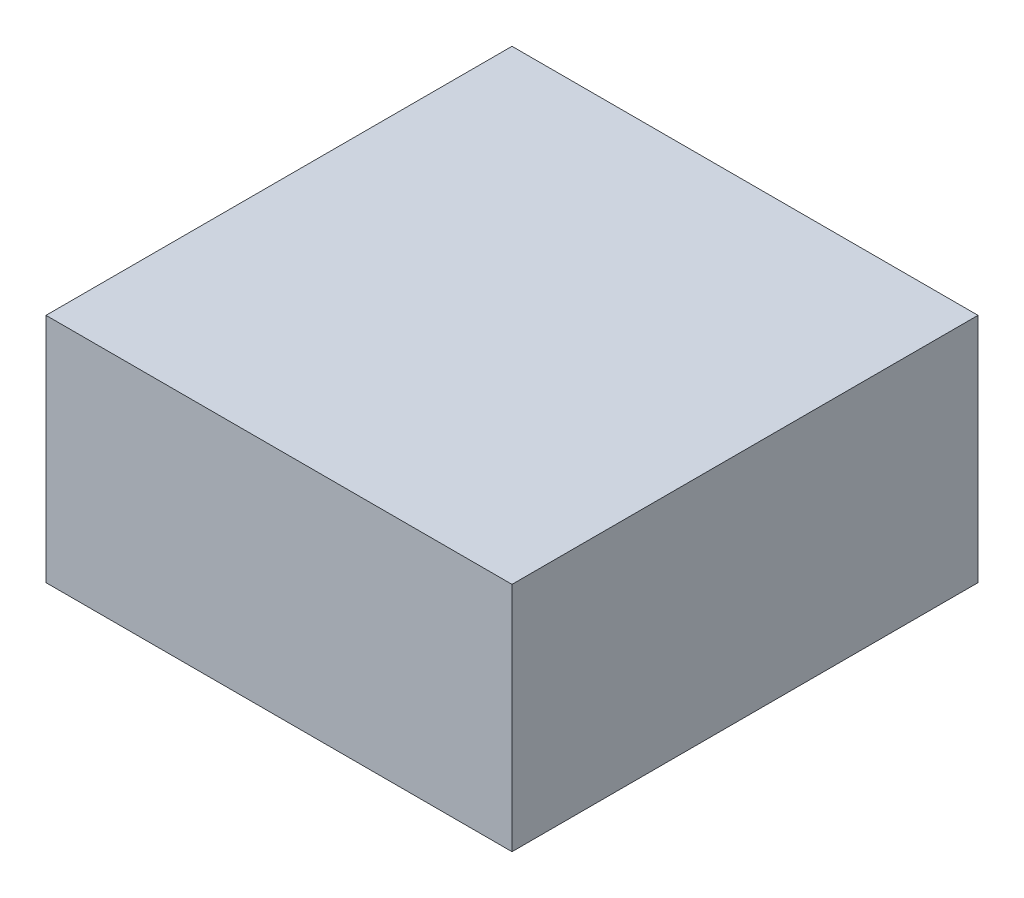
ISO-10303-21;
HEADER;
FILE_DESCRIPTION(('STEP AP214'),'2;1');
FILE_NAME('part.step','',(''),(''),'','','');
FILE_SCHEMA(('AUTOMOTIVE_DESIGN { 1 0 10303 214 1 1 1 1 }'));
ENDSEC;
DATA;
#1=APPLICATION_CONTEXT('core data for automotive mechanical design processes');
#2=APPLICATION_PROTOCOL_DEFINITION('international standard','automotive_design',2000,#1);
#3=PRODUCT_CONTEXT('',#1,'mechanical');
#4=PRODUCT('Part','Part','',(#3));
#5=PRODUCT_RELATED_PRODUCT_CATEGORY('part','',(#4));
#6=PRODUCT_DEFINITION_FORMATION('','',#4);
#7=PRODUCT_DEFINITION_CONTEXT('part definition',#1,'design');
#8=PRODUCT_DEFINITION('design','',#6,#7);
#9=PRODUCT_DEFINITION_SHAPE('','',#8);
#10=(LENGTH_UNIT() NAMED_UNIT(*) SI_UNIT(.MILLI.,.METRE.));
#11=(NAMED_UNIT(*) PLANE_ANGLE_UNIT() SI_UNIT($,.RADIAN.));
#12=(NAMED_UNIT(*) SI_UNIT($,.STERADIAN.) SOLID_ANGLE_UNIT());
#13=UNCERTAINTY_MEASURE_WITH_UNIT(LENGTH_MEASURE(1.E-05),#10,'distance_accuracy_value','');
#14=(GEOMETRIC_REPRESENTATION_CONTEXT(3) GLOBAL_UNCERTAINTY_ASSIGNED_CONTEXT((#13)) GLOBAL_UNIT_ASSIGNED_CONTEXT((#10,
#11,#12)) REPRESENTATION_CONTEXT('',''));
#15=CARTESIAN_POINT('',(0.,0.,0.));
#16=DIRECTION('',(0.,0.,1.));
#17=DIRECTION('',(1.,0.,0.));
#18=AXIS2_PLACEMENT_3D('',#15,#16,#17);
#19=CARTESIAN_POINT('',(0.,2.54,203.2));
#20=DIRECTION('',(1.,0.,0.));
#21=DIRECTION('',(0.,0.,-1.));
#22=AXIS2_PLACEMENT_3D('',#19,#20,#21);
#23=PLANE('',#22);
#24=DIRECTION('',(0.,-1.,0.));
#25=VECTOR('',#24,1.);
#26=CARTESIAN_POINT('',(0.,2.54,0.));
#27=LINE('',#26,#25);
#28=CARTESIAN_POINT('',(0.,2.54,0.));
#29=VERTEX_POINT('',#28);
#30=CARTESIAN_POINT('',(0.,-98.425,0.));
#31=VERTEX_POINT('',#30);
#32=EDGE_CURVE('E154',#29,#31,#27,.T.);
#33=ORIENTED_EDGE('',*,*,#32,.T.);
#34=DIRECTION('',(0.,0.,-1.));
#35=VECTOR('',#34,1.);
#36=CARTESIAN_POINT('',(0.,-98.425,0.));
#37=LINE('',#36,#35);
#38=CARTESIAN_POINT('',(0.,-98.425,203.2));
#39=VERTEX_POINT('',#38);
#40=EDGE_CURVE('E142',#39,#31,#37,.T.);
#41=ORIENTED_EDGE('',*,*,#40,.F.);
#42=DIRECTION('',(0.,-1.,0.));
#43=VECTOR('',#42,1.);
#44=CARTESIAN_POINT('',(0.,2.54,203.2));
#45=LINE('',#44,#43);
#46=CARTESIAN_POINT('',(0.,2.54,203.2));
#47=VERTEX_POINT('',#46);
#48=EDGE_CURVE('E11',#47,#39,#45,.T.);
#49=ORIENTED_EDGE('',*,*,#48,.F.);
#50=DIRECTION('',(0.,0.,1.));
#51=VECTOR('',#50,1.);
#52=CARTESIAN_POINT('',(0.,2.54,203.2));
#53=LINE('',#52,#51);
#54=EDGE_CURVE('E145',#29,#47,#53,.T.);
#55=ORIENTED_EDGE('',*,*,#54,.F.);
#56=EDGE_LOOP('',(#33,#41,#49,#55));
#57=FACE_BOUND('',#56,.T.);
#58=ADVANCED_FACE('F35',(#57),#23,.F.);
#59=CARTESIAN_POINT('',(203.2,2.54,203.2));
#60=DIRECTION('',(0.,0.,-1.));
#61=DIRECTION('',(-1.,0.,0.));
#62=AXIS2_PLACEMENT_3D('',#59,#60,#61);
#63=PLANE('',#62);
#64=ORIENTED_EDGE('',*,*,#48,.T.);
#65=DIRECTION('',(-1.,0.,0.));
#66=VECTOR('',#65,1.);
#67=CARTESIAN_POINT('',(0.,-98.425,203.2));
#68=LINE('',#67,#66);
#69=CARTESIAN_POINT('',(203.2,-98.425,203.2));
#70=VERTEX_POINT('',#69);
#71=EDGE_CURVE('E139',#70,#39,#68,.T.);
#72=ORIENTED_EDGE('',*,*,#71,.F.);
#73=DIRECTION('',(0.,-1.,0.));
#74=VECTOR('',#73,1.);
#75=CARTESIAN_POINT('',(203.2,2.54,203.2));
#76=LINE('',#75,#74);
#77=CARTESIAN_POINT('',(203.2,2.54,203.2));
#78=VERTEX_POINT('',#77);
#79=EDGE_CURVE('E42',#78,#70,#76,.T.);
#80=ORIENTED_EDGE('',*,*,#79,.F.);
#81=DIRECTION('',(1.,0.,0.));
#82=VECTOR('',#81,1.);
#83=CARTESIAN_POINT('',(203.2,2.54,203.2));
#84=LINE('',#83,#82);
#85=EDGE_CURVE('E148',#47,#78,#84,.T.);
#86=ORIENTED_EDGE('',*,*,#85,.F.);
#87=EDGE_LOOP('',(#64,#72,#80,#86));
#88=FACE_BOUND('',#87,.T.);
#89=ADVANCED_FACE('F168',(#88),#63,.F.);
#90=CARTESIAN_POINT('',(203.2,2.54,0.));
#91=DIRECTION('',(-1.,0.,0.));
#92=DIRECTION('',(0.,0.,1.));
#93=AXIS2_PLACEMENT_3D('',#90,#91,#92);
#94=PLANE('',#93);
#95=ORIENTED_EDGE('',*,*,#79,.T.);
#96=DIRECTION('',(0.,0.,1.));
#97=VECTOR('',#96,1.);
#98=CARTESIAN_POINT('',(203.2,-98.425,203.2));
#99=LINE('',#98,#97);
#100=CARTESIAN_POINT('',(203.2,-98.425,0.));
#101=VERTEX_POINT('',#100);
#102=EDGE_CURVE('E136',#101,#70,#99,.T.);
#103=ORIENTED_EDGE('',*,*,#102,.F.);
#104=DIRECTION('',(0.,-1.,0.));
#105=VECTOR('',#104,1.);
#106=CARTESIAN_POINT('',(203.2,2.54,0.));
#107=LINE('',#106,#105);
#108=CARTESIAN_POINT('',(203.2,2.54,0.));
#109=VERTEX_POINT('',#108);
#110=EDGE_CURVE('E156',#109,#101,#107,.T.);
#111=ORIENTED_EDGE('',*,*,#110,.F.);
#112=DIRECTION('',(0.,0.,-1.));
#113=VECTOR('',#112,1.);
#114=CARTESIAN_POINT('',(203.2,2.54,0.));
#115=LINE('',#114,#113);
#116=EDGE_CURVE('E150',#78,#109,#115,.T.);
#117=ORIENTED_EDGE('',*,*,#116,.F.);
#118=EDGE_LOOP('',(#95,#103,#111,#117));
#119=FACE_BOUND('',#118,.T.);
#120=ADVANCED_FACE('F161',(#119),#94,.F.);
#121=CARTESIAN_POINT('',(0.,2.54,0.));
#122=DIRECTION('',(0.,0.,1.));
#123=DIRECTION('',(1.,0.,0.));
#124=AXIS2_PLACEMENT_3D('',#121,#122,#123);
#125=PLANE('',#124);
#126=ORIENTED_EDGE('',*,*,#110,.T.);
#127=DIRECTION('',(1.,0.,0.));
#128=VECTOR('',#127,1.);
#129=CARTESIAN_POINT('',(203.2,-98.425,0.));
#130=LINE('',#129,#128);
#131=EDGE_CURVE('E112',#31,#101,#130,.T.);
#132=ORIENTED_EDGE('',*,*,#131,.F.);
#133=ORIENTED_EDGE('',*,*,#32,.F.);
#134=DIRECTION('',(-1.,0.,0.));
#135=VECTOR('',#134,1.);
#136=CARTESIAN_POINT('',(0.,2.54,0.));
#137=LINE('',#136,#135);
#138=EDGE_CURVE('E152',#109,#29,#137,.T.);
#139=ORIENTED_EDGE('',*,*,#138,.F.);
#140=EDGE_LOOP('',(#126,#132,#133,#139));
#141=FACE_BOUND('',#140,.T.);
#142=ADVANCED_FACE('F174',(#141),#125,.F.);
#143=CARTESIAN_POINT('',(0.,2.54,0.));
#144=DIRECTION('',(0.,-1.,0.));
#145=DIRECTION('',(0.,0.,-1.));
#146=AXIS2_PLACEMENT_3D('',#143,#144,#145);
#147=PLANE('',#146);
#148=ORIENTED_EDGE('',*,*,#54,.T.);
#149=ORIENTED_EDGE('',*,*,#85,.T.);
#150=ORIENTED_EDGE('',*,*,#116,.T.);
#151=ORIENTED_EDGE('',*,*,#138,.T.);
#152=EDGE_LOOP('',(#148,#149,#150,#151));
#153=FACE_BOUND('',#152,.T.);
#154=ADVANCED_FACE('F177',(#153),#147,.F.);
#155=CARTESIAN_POINT('',(0.,-98.425,0.));
#156=DIRECTION('',(0.,1.,0.));
#157=DIRECTION('',(0.,0.,1.));
#158=AXIS2_PLACEMENT_3D('',#155,#156,#157);
#159=PLANE('',#158);
#160=ORIENTED_EDGE('',*,*,#131,.T.);
#161=ORIENTED_EDGE('',*,*,#102,.T.);
#162=ORIENTED_EDGE('',*,*,#71,.T.);
#163=ORIENTED_EDGE('',*,*,#40,.T.);
#164=EDGE_LOOP('',(#160,#161,#162,#163));
#165=FACE_BOUND('',#164,.T.);
#166=DIRECTION('',(-1.,0.,0.));
#167=VECTOR('',#166,1.);
#168=CARTESIAN_POINT('',(200.025,-98.425,200.025));
#169=LINE('',#168,#167);
#170=CARTESIAN_POINT('',(200.025,-98.425,200.025));
#171=VERTEX_POINT('',#170);
#172=CARTESIAN_POINT('',(3.17500000000003,-98.425,200.025));
#173=VERTEX_POINT('',#172);
#174=EDGE_CURVE('E97',#171,#173,#169,.T.);
#175=ORIENTED_EDGE('',*,*,#174,.F.);
#176=DIRECTION('',(0.,0.,1.));
#177=VECTOR('',#176,1.);
#178=CARTESIAN_POINT('',(200.025,-98.425,3.175));
#179=LINE('',#178,#177);
#180=CARTESIAN_POINT('',(200.025,-98.425,3.175));
#181=VERTEX_POINT('',#180);
#182=EDGE_CURVE('E120',#181,#171,#179,.T.);
#183=ORIENTED_EDGE('',*,*,#182,.F.);
#184=DIRECTION('',(1.,0.,0.));
#185=VECTOR('',#184,1.);
#186=CARTESIAN_POINT('',(3.175,-98.425,3.175));
#187=LINE('',#186,#185);
#188=CARTESIAN_POINT('',(3.175,-98.425,3.175));
#189=VERTEX_POINT('',#188);
#190=EDGE_CURVE('E118',#189,#181,#187,.T.);
#191=ORIENTED_EDGE('',*,*,#190,.F.);
#192=DIRECTION('',(0.,0.,-1.));
#193=VECTOR('',#192,1.);
#194=CARTESIAN_POINT('',(3.17500000000003,-98.425,200.025));
#195=LINE('',#194,#193);
#196=EDGE_CURVE('E106',#173,#189,#195,.T.);
#197=ORIENTED_EDGE('',*,*,#196,.F.);
#198=EDGE_LOOP('',(#175,#183,#191,#197));
#199=FACE_BOUND('',#198,.T.);
#200=ADVANCED_FACE('F116',(#165,#199),#159,.F.);
#201=CARTESIAN_POINT('',(200.025,-98.425,200.025));
#202=DIRECTION('',(0.,0.,-1.));
#203=DIRECTION('',(-1.,0.,0.));
#204=AXIS2_PLACEMENT_3D('',#201,#202,#203);
#205=PLANE('',#204);
#206=DIRECTION('',(-1.,0.,0.));
#207=VECTOR('',#206,1.);
#208=CARTESIAN_POINT('',(200.025,0.,200.025));
#209=LINE('',#208,#207);
#210=CARTESIAN_POINT('',(200.025,0.,200.025));
#211=VERTEX_POINT('',#210);
#212=CARTESIAN_POINT('',(3.17500000000003,0.,200.025));
#213=VERTEX_POINT('',#212);
#214=EDGE_CURVE('E49',#211,#213,#209,.T.);
#215=ORIENTED_EDGE('',*,*,#214,.F.);
#216=DIRECTION('',(0.,1.,0.));
#217=VECTOR('',#216,1.);
#218=CARTESIAN_POINT('',(200.025,-98.425,200.025));
#219=LINE('',#218,#217);
#220=EDGE_CURVE('E102',#171,#211,#219,.T.);
#221=ORIENTED_EDGE('',*,*,#220,.F.);
#222=ORIENTED_EDGE('',*,*,#174,.T.);
#223=DIRECTION('',(0.,1.,0.));
#224=VECTOR('',#223,1.);
#225=CARTESIAN_POINT('',(3.17500000000003,-98.425,200.025));
#226=LINE('',#225,#224);
#227=EDGE_CURVE('E100',#173,#213,#226,.T.);
#228=ORIENTED_EDGE('',*,*,#227,.T.);
#229=EDGE_LOOP('',(#215,#221,#222,#228));
#230=FACE_BOUND('',#229,.T.);
#231=ADVANCED_FACE('F99',(#230),#205,.T.);
#232=CARTESIAN_POINT('',(3.17500000000003,-98.425,200.025));
#233=DIRECTION('',(1.,0.,0.));
#234=DIRECTION('',(0.,0.,-1.));
#235=AXIS2_PLACEMENT_3D('',#232,#233,#234);
#236=PLANE('',#235);
#237=DIRECTION('',(0.,0.,-1.));
#238=VECTOR('',#237,1.);
#239=CARTESIAN_POINT('',(3.17500000000003,0.,200.025));
#240=LINE('',#239,#238);
#241=CARTESIAN_POINT('',(3.175,0.,3.175));
#242=VERTEX_POINT('',#241);
#243=EDGE_CURVE('E53',#213,#242,#240,.T.);
#244=ORIENTED_EDGE('',*,*,#243,.F.);
#245=ORIENTED_EDGE('',*,*,#227,.F.);
#246=ORIENTED_EDGE('',*,*,#196,.T.);
#247=DIRECTION('',(0.,1.,0.));
#248=VECTOR('',#247,1.);
#249=CARTESIAN_POINT('',(3.175,-98.425,3.175));
#250=LINE('',#249,#248);
#251=EDGE_CURVE('E113',#189,#242,#250,.T.);
#252=ORIENTED_EDGE('',*,*,#251,.T.);
#253=EDGE_LOOP('',(#244,#245,#246,#252));
#254=FACE_BOUND('',#253,.T.);
#255=ADVANCED_FACE('F110',(#254),#236,.T.);
#256=CARTESIAN_POINT('',(3.175,-98.425,3.175));
#257=DIRECTION('',(0.,0.,1.));
#258=DIRECTION('',(1.,0.,0.));
#259=AXIS2_PLACEMENT_3D('',#256,#257,#258);
#260=PLANE('',#259);
#261=DIRECTION('',(1.,0.,0.));
#262=VECTOR('',#261,1.);
#263=CARTESIAN_POINT('',(3.175,0.,3.175));
#264=LINE('',#263,#262);
#265=CARTESIAN_POINT('',(200.025,0.,3.175));
#266=VERTEX_POINT('',#265);
#267=EDGE_CURVE('E126',#242,#266,#264,.T.);
#268=ORIENTED_EDGE('',*,*,#267,.F.);
#269=ORIENTED_EDGE('',*,*,#251,.F.);
#270=ORIENTED_EDGE('',*,*,#190,.T.);
#271=DIRECTION('',(0.,1.,0.));
#272=VECTOR('',#271,1.);
#273=CARTESIAN_POINT('',(200.025,-98.425,3.175));
#274=LINE('',#273,#272);
#275=EDGE_CURVE('E130',#181,#266,#274,.T.);
#276=ORIENTED_EDGE('',*,*,#275,.T.);
#277=EDGE_LOOP('',(#268,#269,#270,#276));
#278=FACE_BOUND('',#277,.T.);
#279=ADVANCED_FACE('F201',(#278),#260,.T.);
#280=CARTESIAN_POINT('',(200.025,-98.425,3.175));
#281=DIRECTION('',(-1.,0.,0.));
#282=DIRECTION('',(0.,0.,1.));
#283=AXIS2_PLACEMENT_3D('',#280,#281,#282);
#284=PLANE('',#283);
#285=DIRECTION('',(0.,0.,1.));
#286=VECTOR('',#285,1.);
#287=CARTESIAN_POINT('',(200.025,0.,3.175));
#288=LINE('',#287,#286);
#289=EDGE_CURVE('E107',#266,#211,#288,.T.);
#290=ORIENTED_EDGE('',*,*,#289,.F.);
#291=ORIENTED_EDGE('',*,*,#275,.F.);
#292=ORIENTED_EDGE('',*,*,#182,.T.);
#293=ORIENTED_EDGE('',*,*,#220,.T.);
#294=EDGE_LOOP('',(#290,#291,#292,#293));
#295=FACE_BOUND('',#294,.T.);
#296=ADVANCED_FACE('F197',(#295),#284,.T.);
#297=CARTESIAN_POINT('',(0.,0.,0.));
#298=DIRECTION('',(0.,-1.,0.));
#299=DIRECTION('',(0.,0.,-1.));
#300=AXIS2_PLACEMENT_3D('',#297,#298,#299);
#301=PLANE('',#300);
#302=ORIENTED_EDGE('',*,*,#214,.T.);
#303=ORIENTED_EDGE('',*,*,#243,.T.);
#304=ORIENTED_EDGE('',*,*,#267,.T.);
#305=ORIENTED_EDGE('',*,*,#289,.T.);
#306=EDGE_LOOP('',(#302,#303,#304,#305));
#307=FACE_BOUND('',#306,.T.);
#308=ADVANCED_FACE('F195',(#307),#301,.T.);
#309=CLOSED_SHELL('',(#58,#89,#120,#142,#154,#200,#231,#255,#279,#296,#308));
#310=MANIFOLD_SOLID_BREP('B2',#309);
#311=ADVANCED_BREP_SHAPE_REPRESENTATION('',(#18,#310),#14);
#312=SHAPE_DEFINITION_REPRESENTATION(#9,#311);
ENDSEC;
END-ISO-10303-21;
